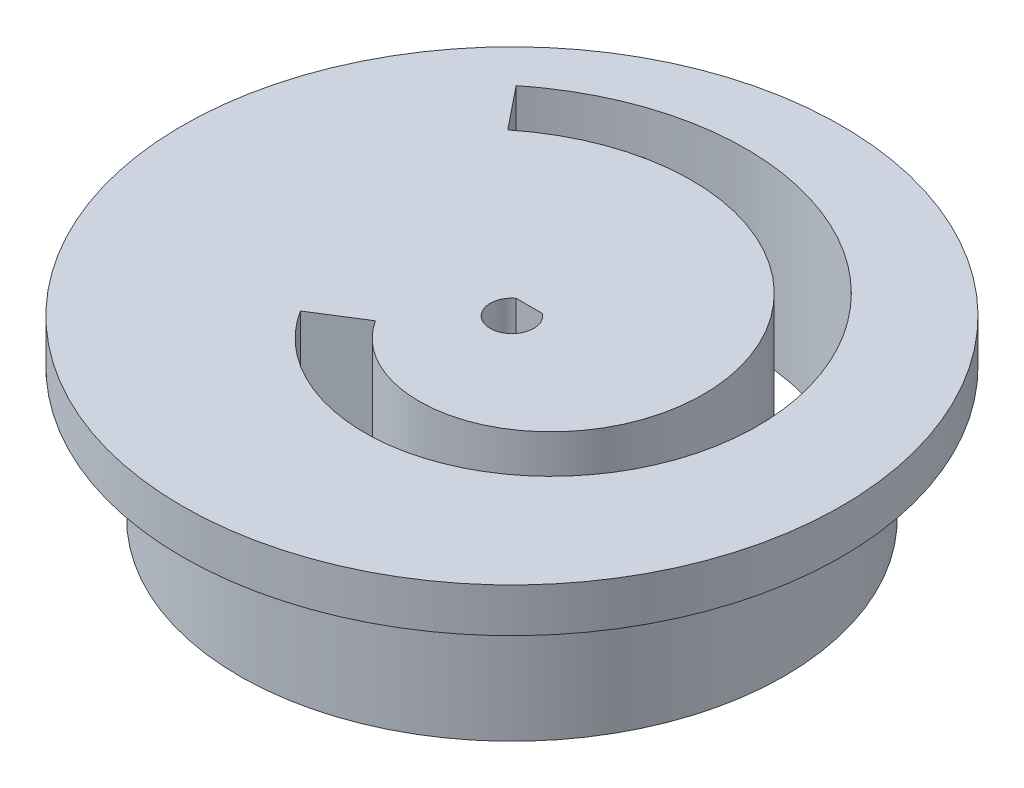
ISO-10303-21;
HEADER;
FILE_DESCRIPTION(('STEP AP214'),'2;1');
FILE_NAME('part.step','',(''),(''),'','','');
FILE_SCHEMA(('AUTOMOTIVE_DESIGN { 1 0 10303 214 1 1 1 1 }'));
ENDSEC;
DATA;
#1=APPLICATION_CONTEXT('core data for automotive mechanical design processes');
#2=APPLICATION_PROTOCOL_DEFINITION('international standard','automotive_design',2000,#1);
#3=PRODUCT_CONTEXT('',#1,'mechanical');
#4=PRODUCT('Part','Part','',(#3));
#5=PRODUCT_RELATED_PRODUCT_CATEGORY('part','',(#4));
#6=PRODUCT_DEFINITION_FORMATION('','',#4);
#7=PRODUCT_DEFINITION_CONTEXT('part definition',#1,'design');
#8=PRODUCT_DEFINITION('design','',#6,#7);
#9=PRODUCT_DEFINITION_SHAPE('','',#8);
#10=(LENGTH_UNIT() NAMED_UNIT(*) SI_UNIT(.MILLI.,.METRE.));
#11=(NAMED_UNIT(*) PLANE_ANGLE_UNIT() SI_UNIT($,.RADIAN.));
#12=(NAMED_UNIT(*) SI_UNIT($,.STERADIAN.) SOLID_ANGLE_UNIT());
#13=UNCERTAINTY_MEASURE_WITH_UNIT(LENGTH_MEASURE(1.E-05),#10,'distance_accuracy_value','');
#14=(GEOMETRIC_REPRESENTATION_CONTEXT(3) GLOBAL_UNCERTAINTY_ASSIGNED_CONTEXT((#13)) GLOBAL_UNIT_ASSIGNED_CONTEXT((#10,
#11,#12)) REPRESENTATION_CONTEXT('',''));
#15=CARTESIAN_POINT('',(0.,0.,0.));
#16=DIRECTION('',(0.,0.,1.));
#17=DIRECTION('',(1.,0.,0.));
#18=AXIS2_PLACEMENT_3D('',#15,#16,#17);
#19=CARTESIAN_POINT('',(0.,5.,0.));
#20=DIRECTION('',(0.,-1.,0.));
#21=DIRECTION('',(0.,0.,-1.));
#22=AXIS2_PLACEMENT_3D('',#19,#20,#21);
#23=CYLINDRICAL_SURFACE('',#22,37.5);
#24=CARTESIAN_POINT('',(0.,5.,0.));
#25=DIRECTION('',(0.,1.,0.));
#26=DIRECTION('',(0.,0.,1.));
#27=AXIS2_PLACEMENT_3D('',#24,#25,#26);
#28=CIRCLE('',#27,37.5);
#29=CARTESIAN_POINT('',(0.,5.,37.5));
#30=VERTEX_POINT('',#29);
#31=EDGE_CURVE('E186',#30,#30,#28,.T.);
#32=ORIENTED_EDGE('',*,*,#31,.F.);
#33=EDGE_LOOP('',(#32));
#34=FACE_BOUND('',#33,.T.);
#35=CARTESIAN_POINT('',(0.,0.,0.));
#36=DIRECTION('',(0.,1.,0.));
#37=DIRECTION('',(0.,0.,1.));
#38=AXIS2_PLACEMENT_3D('',#35,#36,#37);
#39=CIRCLE('',#38,37.5);
#40=CARTESIAN_POINT('',(0.,0.,37.5));
#41=VERTEX_POINT('',#40);
#42=EDGE_CURVE('E189',#41,#41,#39,.T.);
#43=ORIENTED_EDGE('',*,*,#42,.T.);
#44=EDGE_LOOP('',(#43));
#45=FACE_BOUND('',#44,.T.);
#46=ADVANCED_FACE('F33',(#34,#45),#23,.T.);
#47=CARTESIAN_POINT('',(0.,5.,0.));
#48=DIRECTION('',(0.,1.,0.));
#49=DIRECTION('',(0.,0.,1.));
#50=AXIS2_PLACEMENT_3D('',#47,#48,#49);
#51=PLANE('',#50);
#52=CARTESIAN_POINT('',(-12.5229604017019,5.,11.5509878834567));
#53=CARTESIAN_POINT('',(-11.6004952961157,5.,13.0163621993928));
#54=CARTESIAN_POINT('',(-10.4309767036001,5.,14.3699254940499));
#55=CARTESIAN_POINT('',(-7.6500753799408,5.,16.7161851548468));
#56=CARTESIAN_POINT('',(-6.04930775763706,5.,17.6993436339623));
#57=CARTESIAN_POINT('',(-2.52624567461753,5.,19.1649897706663));
#58=CARTESIAN_POINT('',(-0.616520535725296,5.,19.6419137684396));
#59=CARTESIAN_POINT('',(3.36164703541632,5.,19.9966669523599));
#60=CARTESIAN_POINT('',(5.41650373351934,5.,19.8729748340134));
#61=CARTESIAN_POINT('',(9.49306074908555,5.,18.9816638357261));
#62=CARTESIAN_POINT('',(11.5013996709827,5.,18.2166506958334));
#63=CARTESIAN_POINT('',(15.2816834739461,5.,16.0596794721663));
#64=CARTESIAN_POINT('',(17.0416927338188,5.,14.6741767706611));
#65=CARTESIAN_POINT('',(20.1306178558642,5.,11.3574094932143));
#66=CARTESIAN_POINT('',(21.4500847049044,5.,9.4358386409608));
#67=CARTESIAN_POINT('',(23.4919551756464,5.,5.188328830345));
#68=CARTESIAN_POINT('',(24.2082275471741,5.,2.87443265795955));
#69=CARTESIAN_POINT('',(24.9249201685777,5.,-1.966413331751));
#70=CARTESIAN_POINT('',(24.923059122942,5.,-4.4800594985828));
#71=CARTESIAN_POINT('',(24.1466443633982,5.,-9.49504246014136));
#72=CARTESIAN_POINT('',(23.3738489642896,5.,-11.9830063018267));
#73=CARTESIAN_POINT('',(21.0700954924437,5.,-16.7073582521203));
#74=CARTESIAN_POINT('',(19.544768330187,5.,-18.931495095212));
#75=CARTESIAN_POINT('',(15.8247275121424,5.,-22.8976484259414));
#76=CARTESIAN_POINT('',(13.6390101837641,5.,-24.6296223059436));
#77=CARTESIAN_POINT('',(8.75693639582438,5.,-27.4126137651256));
#78=CARTESIAN_POINT('',(6.07214004958612,5.,-28.4566862383165));
#79=CARTESIAN_POINT('',(0.409277256728125,5.,-29.7178505268334));
#80=CARTESIAN_POINT('',(-2.55569040842167,5.,-29.9317087538947));
#81=CARTESIAN_POINT('',(-8.52055394473071,5.,-29.456293242984));
#82=CARTESIAN_POINT('',(-11.506970883009,5.,-28.7677839031858));
#83=CARTESIAN_POINT('',(-17.2379411212992,5.,-26.4925211573097));
#84=CARTESIAN_POINT('',(-19.9698258260303,5.,-24.910464833472));
#85=CARTESIAN_POINT('',(-22.4458759431602,5.,-22.9242067244719));
#86=B_SPLINE_CURVE_WITH_KNOTS('',3,(#52,#53,#54,#55,#56,#57,#58,#59,#60,#61,#62,#63,#64,#65,#66,
#67,#68,#69,#70,#71,#72,#73,#74,#75,#76,#77,#78,#79,#80,#81,#82,#83,#84,#85),.UNSPECIFIED.,.F.,
.F.,(4,2,2,2,2,2,2,2,2,2,2,2,2,2,2,2,4),(0.,0.0625,0.125,0.1875,0.25,0.3125,0.375,0.4375,0.5,
0.5625,0.625,0.6875,0.75,0.8125,0.875,0.9375,1.),.UNSPECIFIED.);
#87=CARTESIAN_POINT('',(-12.5229604017019,5.,11.5509878834567));
#88=VERTEX_POINT('',#87);
#89=CARTESIAN_POINT('',(-22.4458759431602,5.,-22.9242067244719));
#90=VERTEX_POINT('',#89);
#91=EDGE_CURVE('E51',#88,#90,#86,.T.);
#92=ORIENTED_EDGE('',*,*,#91,.F.);
#93=DIRECTION('',(-0.846279182287191,0.,0.532739660272561));
#94=VECTOR('',#93,1.);
#95=CARTESIAN_POINT('',(-12.5229604017019,5.,11.5509878834567));
#96=LINE('',#95,#94);
#97=CARTESIAN_POINT('',(-7.27602947152129,5.,8.24800198976681));
#98=VERTEX_POINT('',#97);
#99=EDGE_CURVE('E295',#98,#88,#96,.T.);
#100=ORIENTED_EDGE('',*,*,#99,.F.);
#101=CARTESIAN_POINT('',(-18.5663173656599,5.,-18.0879865843475));
#102=CARTESIAN_POINT('',(-16.5740630818423,5.,-19.6861493998119));
#103=CARTESIAN_POINT('',(-14.3732618847466,5.,-20.9590867668143));
#104=CARTESIAN_POINT('',(-9.7961098196643,5.,-22.7762700957926));
#105=CARTESIAN_POINT('',(-7.40867153427233,5.,-23.3252516131446));
#106=CARTESIAN_POINT('',(-2.68238405132616,5.,-23.7019493137271));
#107=CARTESIAN_POINT('',(-0.33151274899056,5.,-23.5309346736126));
#108=CARTESIAN_POINT('',(4.11739089219686,5.,-22.5401286801503));
#109=CARTESIAN_POINT('',(6.22732020312036,5.,-21.7180051694615));
#110=CARTESIAN_POINT('',(10.0277598861644,5.,-19.5515915431096));
#111=CARTESIAN_POINT('',(11.7289844633963,5.,-18.2015502080913));
#112=CARTESIAN_POINT('',(14.5962665791881,5.,-15.144572860282));
#113=CARTESIAN_POINT('',(15.7708930715796,5.,-13.4289531028443));
#114=CARTESIAN_POINT('',(17.5275712219745,5.,-9.82649913054221));
#115=CARTESIAN_POINT('',(18.1152648217339,5.,-7.92879982989393));
#116=CARTESIAN_POINT('',(18.7004268238914,5.,-4.14914799497067));
#117=CARTESIAN_POINT('',(18.7000798314222,5.,-2.25510179651066));
#118=CARTESIAN_POINT('',(18.166772452826,5.,1.34708247030139));
#119=CARTESIAN_POINT('',(17.6323100635544,5.,3.06746971171144));
#120=CARTESIAN_POINT('',(16.1339926698692,5.,6.18427752116164));
#121=CARTESIAN_POINT('',(15.1650449028983,5.,7.59200202005319));
#122=CARTESIAN_POINT('',(12.9330090731689,5.,9.98867500810966));
#123=CARTESIAN_POINT('',(11.661654701102,5.,10.9869498688067));
#124=CARTESIAN_POINT('',(8.97616014520221,5.,12.5192513520577));
#125=CARTESIAN_POINT('',(7.55128721075826,5.,13.0597543130632));
#126=CARTESIAN_POINT('',(4.70967200455877,5.,13.6810538254985));
#127=CARTESIAN_POINT('',(3.28067084926525,5.,13.764842941522));
#128=CARTESIAN_POINT('',(0.565855338207264,5.,13.5227492063836));
#129=CARTESIAN_POINT('',(-0.732647761425421,5.,13.1960397679267));
#130=CARTESIAN_POINT('',(-3.0800342543436,5.,12.21949213305));
#131=CARTESIAN_POINT('',(-4.14087536565807,5.,11.5650064919811));
#132=CARTESIAN_POINT('',(-5.94402757615389,5.,10.0436784039367));
#133=CARTESIAN_POINT('',(-6.69667502990474,5.,9.1683306975166));
#134=CARTESIAN_POINT('',(-7.27602947152129,5.,8.24800198976681));
#135=B_SPLINE_CURVE_WITH_KNOTS('',3,(#101,#102,#103,#104,#105,#106,#107,#108,#109,#110,#111,
#112,#113,#114,#115,#116,#117,#118,#119,#120,#121,#122,#123,#124,#125,#126,#127,#128,#129,#130,
#131,#132,#133,#134),.UNSPECIFIED.,.F.,.F.,(4,2,2,2,2,2,2,2,2,2,2,2,2,2,2,2,4),(0.,0.0625,0.125,
0.1875,0.25,0.3125,0.375,0.4375,0.5,0.5625,0.625,0.6875,0.75,0.8125,0.875,0.9375,1.),.UNSPECIFIED.);
#136=CARTESIAN_POINT('',(-18.5663173656599,5.,-18.0879865843475));
#137=VERTEX_POINT('',#136);
#138=EDGE_CURVE('E105',#137,#98,#135,.T.);
#139=ORIENTED_EDGE('',*,*,#138,.F.);
#140=DIRECTION('',(0.625735254435522,0.,0.780035506471668));
#141=VECTOR('',#140,1.);
#142=CARTESIAN_POINT('',(-22.4458759431602,5.,-22.9242067244719));
#143=LINE('',#142,#141);
#144=EDGE_CURVE('E285',#90,#137,#143,.T.);
#145=ORIENTED_EDGE('',*,*,#144,.F.);
#146=EDGE_LOOP('',(#92,#100,#139,#145));
#147=FACE_BOUND('',#146,.T.);
#148=CARTESIAN_POINT('',(0.,5.,0.));
#149=DIRECTION('',(0.,-1.,0.));
#150=DIRECTION('',(0.,0.,-1.));
#151=AXIS2_PLACEMENT_3D('',#148,#149,#150);
#152=CIRCLE('',#151,2.475);
#153=CARTESIAN_POINT('',(1.49164338901763,5.,-1.975));
#154=VERTEX_POINT('',#153);
#155=CARTESIAN_POINT('',(-1.49164338901763,5.,-1.975));
#156=VERTEX_POINT('',#155);
#157=EDGE_CURVE('E223',#154,#156,#152,.T.);
#158=ORIENTED_EDGE('',*,*,#157,.T.);
#159=DIRECTION('',(1.,0.,0.));
#160=VECTOR('',#159,1.);
#161=CARTESIAN_POINT('',(1.49164338901763,5.,-1.975));
#162=LINE('',#161,#160);
#163=EDGE_CURVE('E229',#156,#154,#162,.T.);
#164=ORIENTED_EDGE('',*,*,#163,.T.);
#165=EDGE_LOOP('',(#158,#164));
#166=FACE_BOUND('',#165,.T.);
#167=ORIENTED_EDGE('',*,*,#31,.T.);
#168=EDGE_LOOP('',(#167));
#169=FACE_BOUND('',#168,.T.);
#170=ADVANCED_FACE('F161',(#147,#166,#169),#51,.T.);
#171=CARTESIAN_POINT('',(0.,0.,0.));
#172=DIRECTION('',(0.,1.,0.));
#173=DIRECTION('',(0.,0.,1.));
#174=AXIS2_PLACEMENT_3D('',#171,#172,#173);
#175=PLANE('',#174);
#176=CARTESIAN_POINT('',(0.,0.,0.));
#177=DIRECTION('',(0.,-1.,0.));
#178=DIRECTION('',(0.,0.,-1.));
#179=AXIS2_PLACEMENT_3D('',#176,#177,#178);
#180=CIRCLE('',#179,31.);
#181=CARTESIAN_POINT('',(-13.040405028587,0.,-28.1237948486758));
#182=VERTEX_POINT('',#181);
#183=CARTESIAN_POINT('',(-21.7645943525418,0.,-22.0749276934106));
#184=VERTEX_POINT('',#183);
#185=EDGE_CURVE('E43',#182,#184,#180,.T.);
#186=ORIENTED_EDGE('',*,*,#185,.F.);
#187=CARTESIAN_POINT('',(-12.5229604017019,0.,11.5509878834567));
#188=CARTESIAN_POINT('',(-11.6004952961157,0.,13.0163621993928));
#189=CARTESIAN_POINT('',(-10.4309767036001,0.,14.3699254940499));
#190=CARTESIAN_POINT('',(-7.6500753799408,0.,16.7161851548468));
#191=CARTESIAN_POINT('',(-6.04930775763706,0.,17.6993436339623));
#192=CARTESIAN_POINT('',(-2.52624567461753,0.,19.1649897706663));
#193=CARTESIAN_POINT('',(-0.616520535725296,0.,19.6419137684396));
#194=CARTESIAN_POINT('',(3.36164703541632,0.,19.9966669523599));
#195=CARTESIAN_POINT('',(5.41650373351934,0.,19.8729748340134));
#196=CARTESIAN_POINT('',(9.49306074908555,0.,18.9816638357261));
#197=CARTESIAN_POINT('',(11.5013996709827,0.,18.2166506958334));
#198=CARTESIAN_POINT('',(15.2816834739461,0.,16.0596794721663));
#199=CARTESIAN_POINT('',(17.0416927338188,0.,14.6741767706611));
#200=CARTESIAN_POINT('',(20.1306178558642,0.,11.3574094932143));
#201=CARTESIAN_POINT('',(21.4500847049044,0.,9.4358386409608));
#202=CARTESIAN_POINT('',(23.4919551756464,0.,5.188328830345));
#203=CARTESIAN_POINT('',(24.2082275471741,0.,2.87443265795955));
#204=CARTESIAN_POINT('',(24.9249201685777,0.,-1.966413331751));
#205=CARTESIAN_POINT('',(24.923059122942,0.,-4.4800594985828));
#206=CARTESIAN_POINT('',(24.1466443633982,0.,-9.49504246014136));
#207=CARTESIAN_POINT('',(23.3738489642896,0.,-11.9830063018267));
#208=CARTESIAN_POINT('',(21.0700954924437,0.,-16.7073582521203));
#209=CARTESIAN_POINT('',(19.544768330187,0.,-18.931495095212));
#210=CARTESIAN_POINT('',(15.8247275121424,0.,-22.8976484259414));
#211=CARTESIAN_POINT('',(13.6390101837641,0.,-24.6296223059436));
#212=CARTESIAN_POINT('',(8.75693639582438,0.,-27.4126137651256));
#213=CARTESIAN_POINT('',(6.07214004958612,0.,-28.4566862383165));
#214=CARTESIAN_POINT('',(0.409277256728125,0.,-29.7178505268334));
#215=CARTESIAN_POINT('',(-2.55569040842167,0.,-29.9317087538947));
#216=CARTESIAN_POINT('',(-8.52055394473071,0.,-29.456293242984));
#217=CARTESIAN_POINT('',(-11.506970883009,0.,-28.7677839031858));
#218=CARTESIAN_POINT('',(-17.2379411212992,0.,-26.4925211573097));
#219=CARTESIAN_POINT('',(-19.9698258260303,0.,-24.910464833472));
#220=CARTESIAN_POINT('',(-22.4458759431602,0.,-22.9242067244719));
#221=B_SPLINE_CURVE_WITH_KNOTS('',3,(#187,#188,#189,#190,#191,#192,#193,#194,#195,#196,#197,
#198,#199,#200,#201,#202,#203,#204,#205,#206,#207,#208,#209,#210,#211,#212,#213,#214,#215,#216,
#217,#218,#219,#220),.UNSPECIFIED.,.F.,.F.,(4,2,2,2,2,2,2,2,2,2,2,2,2,2,2,2,4),(0.,0.0625,0.125,
0.1875,0.25,0.3125,0.375,0.4375,0.5,0.5625,0.625,0.6875,0.75,0.8125,0.875,0.9375,1.),.UNSPECIFIED.);
#222=CARTESIAN_POINT('',(-22.4458759431602,0.,-22.9242067244719));
#223=VERTEX_POINT('',#222);
#224=EDGE_CURVE('E209',#182,#223,#221,.T.);
#225=ORIENTED_EDGE('',*,*,#224,.T.);
#226=DIRECTION('',(0.625735254435522,0.,0.780035506471668));
#227=VECTOR('',#226,1.);
#228=CARTESIAN_POINT('',(-2.46810713388234,0.,1.97988634181499));
#229=LINE('',#228,#227);
#230=EDGE_CURVE('E210',#223,#184,#229,.T.);
#231=ORIENTED_EDGE('',*,*,#230,.T.);
#232=EDGE_LOOP('',(#186,#225,#231));
#233=FACE_BOUND('',#232,.T.);
#234=ORIENTED_EDGE('',*,*,#42,.F.);
#235=EDGE_LOOP('',(#234));
#236=FACE_BOUND('',#235,.T.);
#237=ADVANCED_FACE('F169',(#233,#236),#175,.F.);
#238=CARTESIAN_POINT('',(0.,-15.,0.));
#239=DIRECTION('',(0.,1.,0.));
#240=DIRECTION('',(0.,0.,1.));
#241=AXIS2_PLACEMENT_3D('',#238,#239,#240);
#242=CYLINDRICAL_SURFACE('',#241,31.);
#243=CARTESIAN_POINT('',(0.,-15.,0.));
#244=DIRECTION('',(0.,-1.,0.));
#245=DIRECTION('',(0.,0.,-1.));
#246=AXIS2_PLACEMENT_3D('',#243,#244,#245);
#247=CIRCLE('',#246,31.);
#248=CARTESIAN_POINT('',(-13.039924450477,-15.,-28.1240176544793));
#249=VERTEX_POINT('',#248);
#250=CARTESIAN_POINT('',(-21.7645943525418,-15.,-22.0749276934106));
#251=VERTEX_POINT('',#250);
#252=EDGE_CURVE('E190',#249,#251,#247,.T.);
#253=ORIENTED_EDGE('',*,*,#252,.F.);
#254=DIRECTION('',(0.,1.,0.));
#255=VECTOR('',#254,1.);
#256=CARTESIAN_POINT('',(-13.040405028587,-15.,-28.1237948486758));
#257=LINE('',#256,#255);
#258=EDGE_CURVE('E206',#249,#182,#257,.T.);
#259=ORIENTED_EDGE('',*,*,#258,.T.);
#260=ORIENTED_EDGE('',*,*,#185,.T.);
#261=DIRECTION('',(0.,1.,0.));
#262=VECTOR('',#261,1.);
#263=CARTESIAN_POINT('',(-21.7645943525418,-15.,-22.0749276934106));
#264=LINE('',#263,#262);
#265=EDGE_CURVE('E205',#184,#251,#264,.F.);
#266=ORIENTED_EDGE('',*,*,#265,.T.);
#267=EDGE_LOOP('',(#253,#259,#260,#266));
#268=FACE_BOUND('',#267,.T.);
#269=ADVANCED_FACE('F145',(#268),#242,.T.);
#270=CARTESIAN_POINT('',(0.,-15.,0.));
#271=DIRECTION('',(0.,-1.,0.));
#272=DIRECTION('',(0.,0.,-1.));
#273=AXIS2_PLACEMENT_3D('',#270,#271,#272);
#274=PLANE('',#273);
#275=CARTESIAN_POINT('',(-13.0399068274558,-15.,-28.123966523314));
#276=CARTESIAN_POINT('',(-10.5868733404784,-15.,-28.9692314536273));
#277=CARTESIAN_POINT('',(-8.06107184558715,-15.,-29.4929151900895));
#278=CARTESIAN_POINT('',(-2.55569040842167,-15.,-29.9317087538947));
#279=CARTESIAN_POINT('',(0.409277256728125,-15.,-29.7178505268334));
#280=CARTESIAN_POINT('',(6.07214004958612,-15.,-28.4566862383165));
#281=CARTESIAN_POINT('',(8.75693639582438,-15.,-27.4126137651256));
#282=CARTESIAN_POINT('',(13.6390101837641,-15.,-24.6296223059436));
#283=CARTESIAN_POINT('',(15.8247275121424,-15.,-22.8976484259414));
#284=CARTESIAN_POINT('',(19.544768330187,-15.,-18.931495095212));
#285=CARTESIAN_POINT('',(21.0700954924437,-15.,-16.7073582521203));
#286=CARTESIAN_POINT('',(23.3738489642896,-15.,-11.9830063018267));
#287=CARTESIAN_POINT('',(24.1466443633982,-15.,-9.49504246014136));
#288=CARTESIAN_POINT('',(24.923059122942,-15.,-4.4800594985828));
#289=CARTESIAN_POINT('',(24.9249201685777,-15.,-1.966413331751));
#290=CARTESIAN_POINT('',(24.2082275471741,-15.,2.87443265795955));
#291=CARTESIAN_POINT('',(23.4919551756464,-15.,5.188328830345));
#292=CARTESIAN_POINT('',(21.4500847049044,-15.,9.4358386409608));
#293=CARTESIAN_POINT('',(20.1306178558642,-15.,11.3574094932143));
#294=CARTESIAN_POINT('',(17.0416927338188,-15.,14.6741767706611));
#295=CARTESIAN_POINT('',(15.2816834739461,-15.,16.0596794721663));
#296=CARTESIAN_POINT('',(11.5013996709827,-15.,18.2166506958334));
#297=CARTESIAN_POINT('',(9.49306074908555,-15.,18.9816638357261));
#298=CARTESIAN_POINT('',(5.41650373351934,-15.,19.8729748340134));
#299=CARTESIAN_POINT('',(3.36164703541632,-15.,19.9966669523599));
#300=CARTESIAN_POINT('',(-0.616520535725296,-15.,19.6419137684396));
#301=CARTESIAN_POINT('',(-2.52624567461753,-15.,19.1649897706663));
#302=CARTESIAN_POINT('',(-6.04930775763706,-15.,17.6993436339623));
#303=CARTESIAN_POINT('',(-7.6500753799408,-15.,16.7161851548468));
#304=CARTESIAN_POINT('',(-10.4309767036001,-15.,14.3699254940499));
#305=CARTESIAN_POINT('',(-11.6004952961157,-15.,13.0163621993928));
#306=CARTESIAN_POINT('',(-12.5229604017019,-15.,11.5509878834567));
#307=B_SPLINE_CURVE_WITH_KNOTS('',3,(#275,#276,#277,#278,#279,#280,#281,#282,#283,#284,#285,
#286,#287,#288,#289,#290,#291,#292,#293,#294,#295,#296,#297,#298,#299,#300,#301,#302,#303,#304,
#305,#306),.UNSPECIFIED.,.F.,.F.,(4,2,2,2,2,2,2,2,2,2,2,2,2,2,2,4),(0.,0.0528710685008421,
0.115371068500842,0.177871068500842,0.240371068500842,0.302871068500842,0.365371068500842,
0.427871068500842,0.490371068500842,0.552871068500842,0.615371068500842,0.677871068500842,
0.740371068500842,0.802871068500842,0.865371068500842,0.927871068500842),.UNSPECIFIED.);
#308=CARTESIAN_POINT('',(-12.5229604017019,-15.,11.5509878834567));
#309=VERTEX_POINT('',#308);
#310=EDGE_CURVE('E126',#309,#249,#307,.F.);
#311=ORIENTED_EDGE('',*,*,#310,.T.);
#312=ORIENTED_EDGE('',*,*,#252,.T.);
#313=DIRECTION('',(-0.625735254435522,0.,-0.780035506471668));
#314=VECTOR('',#313,1.);
#315=CARTESIAN_POINT('',(-2.46810713388234,-15.,1.97988634181499));
#316=LINE('',#315,#314);
#317=CARTESIAN_POINT('',(-18.5663173656599,-15.,-18.0879865843475));
#318=VERTEX_POINT('',#317);
#319=EDGE_CURVE('E11',#318,#251,#316,.T.);
#320=ORIENTED_EDGE('',*,*,#319,.F.);
#321=CARTESIAN_POINT('',(-7.27602947152129,-15.,8.24800198976681));
#322=CARTESIAN_POINT('',(-6.69667502990474,-15.,9.1683306975166));
#323=CARTESIAN_POINT('',(-5.94402757615389,-15.,10.0436784039367));
#324=CARTESIAN_POINT('',(-4.14087536565807,-15.,11.5650064919811));
#325=CARTESIAN_POINT('',(-3.0800342543436,-15.,12.21949213305));
#326=CARTESIAN_POINT('',(-0.732647761425421,-15.,13.1960397679267));
#327=CARTESIAN_POINT('',(0.565855338207264,-15.,13.5227492063836));
#328=CARTESIAN_POINT('',(3.28067084926525,-15.,13.764842941522));
#329=CARTESIAN_POINT('',(4.70967200455877,-15.,13.6810538254985));
#330=CARTESIAN_POINT('',(7.55128721075826,-15.,13.0597543130632));
#331=CARTESIAN_POINT('',(8.97616014520221,-15.,12.5192513520577));
#332=CARTESIAN_POINT('',(11.661654701102,-15.,10.9869498688067));
#333=CARTESIAN_POINT('',(12.9330090731689,-15.,9.98867500810966));
#334=CARTESIAN_POINT('',(15.1650449028983,-15.,7.59200202005319));
#335=CARTESIAN_POINT('',(16.1339926698692,-15.,6.18427752116164));
#336=CARTESIAN_POINT('',(17.6323100635544,-15.,3.06746971171144));
#337=CARTESIAN_POINT('',(18.166772452826,-15.,1.34708247030139));
#338=CARTESIAN_POINT('',(18.7000798314222,-15.,-2.25510179651066));
#339=CARTESIAN_POINT('',(18.7004268238914,-15.,-4.14914799497067));
#340=CARTESIAN_POINT('',(18.1152648217339,-15.,-7.92879982989393));
#341=CARTESIAN_POINT('',(17.5275712219745,-15.,-9.82649913054221));
#342=CARTESIAN_POINT('',(15.7708930715796,-15.,-13.4289531028443));
#343=CARTESIAN_POINT('',(14.5962665791881,-15.,-15.144572860282));
#344=CARTESIAN_POINT('',(11.7289844633963,-15.,-18.2015502080913));
#345=CARTESIAN_POINT('',(10.0277598861644,-15.,-19.5515915431096));
#346=CARTESIAN_POINT('',(6.22732020312036,-15.,-21.7180051694615));
#347=CARTESIAN_POINT('',(4.11739089219686,-15.,-22.5401286801503));
#348=CARTESIAN_POINT('',(-0.33151274899056,-15.,-23.5309346736126));
#349=CARTESIAN_POINT('',(-2.68238405132616,-15.,-23.7019493137271));
#350=CARTESIAN_POINT('',(-7.40867153427233,-15.,-23.3252516131446));
#351=CARTESIAN_POINT('',(-9.7961098196643,-15.,-22.7762700957926));
#352=CARTESIAN_POINT('',(-14.3732618847466,-15.,-20.9590867668143));
#353=CARTESIAN_POINT('',(-16.5740630818423,-15.,-19.6861493998119));
#354=CARTESIAN_POINT('',(-18.5663173656599,-15.,-18.0879865843475));
#355=B_SPLINE_CURVE_WITH_KNOTS('',3,(#321,#322,#323,#324,#325,#326,#327,#328,#329,#330,#331,
#332,#333,#334,#335,#336,#337,#338,#339,#340,#341,#342,#343,#344,#345,#346,#347,#348,#349,#350,
#351,#352,#353,#354),.UNSPECIFIED.,.F.,.F.,(4,2,2,2,2,2,2,2,2,2,2,2,2,2,2,2,4),(0.,0.0625,0.125,
0.1875,0.25,0.3125,0.375,0.4375,0.5,0.5625,0.625,0.6875,0.75,0.8125,0.875,0.9375,1.),.UNSPECIFIED.);
#356=CARTESIAN_POINT('',(-7.27602947152129,-15.,8.24800198976681));
#357=VERTEX_POINT('',#356);
#358=EDGE_CURVE('E60',#318,#357,#355,.F.);
#359=ORIENTED_EDGE('',*,*,#358,.T.);
#360=DIRECTION('',(-0.846279182287191,0.,0.532739660272561));
#361=VECTOR('',#360,1.);
#362=CARTESIAN_POINT('',(-12.5229604017019,-15.,11.5509878834567));
#363=LINE('',#362,#361);
#364=EDGE_CURVE('E114',#357,#309,#363,.T.);
#365=ORIENTED_EDGE('',*,*,#364,.T.);
#366=EDGE_LOOP('',(#311,#312,#320,#359,#365));
#367=FACE_BOUND('',#366,.T.);
#368=CARTESIAN_POINT('',(0.,-15.,0.));
#369=DIRECTION('',(0.,-1.,0.));
#370=DIRECTION('',(0.,0.,-1.));
#371=AXIS2_PLACEMENT_3D('',#368,#369,#370);
#372=CIRCLE('',#371,2.475);
#373=CARTESIAN_POINT('',(1.49164338901763,-15.,-1.975));
#374=VERTEX_POINT('',#373);
#375=CARTESIAN_POINT('',(-1.49164338901763,-15.,-1.975));
#376=VERTEX_POINT('',#375);
#377=EDGE_CURVE('E222',#374,#376,#372,.T.);
#378=ORIENTED_EDGE('',*,*,#377,.F.);
#379=DIRECTION('',(1.,0.,0.));
#380=VECTOR('',#379,1.);
#381=CARTESIAN_POINT('',(1.49164338901763,-15.,-1.975));
#382=LINE('',#381,#380);
#383=EDGE_CURVE('E230',#376,#374,#382,.T.);
#384=ORIENTED_EDGE('',*,*,#383,.F.);
#385=EDGE_LOOP('',(#378,#384));
#386=FACE_BOUND('',#385,.T.);
#387=ADVANCED_FACE('F123',(#367,#386),#274,.T.);
#388=CARTESIAN_POINT('',(0.,5.,0.));
#389=DIRECTION('',(0.,-1.,0.));
#390=DIRECTION('',(0.,0.,-1.));
#391=AXIS2_PLACEMENT_3D('',#388,#389,#390);
#392=CYLINDRICAL_SURFACE('',#391,2.475);
#393=ORIENTED_EDGE('',*,*,#377,.T.);
#394=DIRECTION('',(0.,-1.,0.));
#395=VECTOR('',#394,1.);
#396=CARTESIAN_POINT('',(-1.49164338901763,5.,-1.975));
#397=LINE('',#396,#395);
#398=EDGE_CURVE('E199',#156,#376,#397,.T.);
#399=ORIENTED_EDGE('',*,*,#398,.F.);
#400=ORIENTED_EDGE('',*,*,#157,.F.);
#401=DIRECTION('',(0.,-1.,0.));
#402=VECTOR('',#401,1.);
#403=CARTESIAN_POINT('',(1.49164338901763,5.,-1.975));
#404=LINE('',#403,#402);
#405=EDGE_CURVE('E193',#154,#374,#404,.T.);
#406=ORIENTED_EDGE('',*,*,#405,.T.);
#407=EDGE_LOOP('',(#393,#399,#400,#406));
#408=FACE_BOUND('',#407,.T.);
#409=ADVANCED_FACE('F144',(#408),#392,.F.);
#410=CARTESIAN_POINT('',(1.49164338901763,5.,-1.975));
#411=DIRECTION('',(0.,0.,-1.));
#412=DIRECTION('',(-1.,0.,0.));
#413=AXIS2_PLACEMENT_3D('',#410,#411,#412);
#414=PLANE('',#413);
#415=ORIENTED_EDGE('',*,*,#383,.T.);
#416=ORIENTED_EDGE('',*,*,#405,.F.);
#417=ORIENTED_EDGE('',*,*,#163,.F.);
#418=ORIENTED_EDGE('',*,*,#398,.T.);
#419=EDGE_LOOP('',(#415,#416,#417,#418));
#420=FACE_BOUND('',#419,.T.);
#421=ADVANCED_FACE('F241',(#420),#414,.F.);
#422=CARTESIAN_POINT('',(-12.5229604017019,-15.,11.5509878834567));
#423=CARTESIAN_POINT('',(-11.6004952961157,-15.,13.0163621993928));
#424=CARTESIAN_POINT('',(-10.4309767036001,-15.,14.3699254940499));
#425=CARTESIAN_POINT('',(-7.6500753799408,-15.,16.7161851548468));
#426=CARTESIAN_POINT('',(-6.04930775763706,-15.,17.6993436339623));
#427=CARTESIAN_POINT('',(-2.52624567461753,-15.,19.1649897706663));
#428=CARTESIAN_POINT('',(-0.616520535725296,-15.,19.6419137684396));
#429=CARTESIAN_POINT('',(3.36164703541632,-15.,19.9966669523599));
#430=CARTESIAN_POINT('',(5.41650373351934,-15.,19.8729748340134));
#431=CARTESIAN_POINT('',(9.49306074908555,-15.,18.9816638357261));
#432=CARTESIAN_POINT('',(11.5013996709827,-15.,18.2166506958334));
#433=CARTESIAN_POINT('',(15.2816834739461,-15.,16.0596794721663));
#434=CARTESIAN_POINT('',(17.0416927338188,-15.,14.6741767706611));
#435=CARTESIAN_POINT('',(20.1306178558642,-15.,11.3574094932143));
#436=CARTESIAN_POINT('',(21.4500847049044,-15.,9.4358386409608));
#437=CARTESIAN_POINT('',(23.4919551756464,-15.,5.188328830345));
#438=CARTESIAN_POINT('',(24.2082275471741,-15.,2.87443265795955));
#439=CARTESIAN_POINT('',(24.9249201685777,-15.,-1.966413331751));
#440=CARTESIAN_POINT('',(24.923059122942,-15.,-4.4800594985828));
#441=CARTESIAN_POINT('',(24.1466443633982,-15.,-9.49504246014136));
#442=CARTESIAN_POINT('',(23.3738489642896,-15.,-11.9830063018267));
#443=CARTESIAN_POINT('',(21.0700954924437,-15.,-16.7073582521203));
#444=CARTESIAN_POINT('',(19.544768330187,-15.,-18.931495095212));
#445=CARTESIAN_POINT('',(15.8247275121424,-15.,-22.8976484259414));
#446=CARTESIAN_POINT('',(13.6390101837641,-15.,-24.6296223059436));
#447=CARTESIAN_POINT('',(8.75693639582438,-15.,-27.4126137651256));
#448=CARTESIAN_POINT('',(6.07214004958612,-15.,-28.4566862383165));
#449=CARTESIAN_POINT('',(0.409277256728125,-15.,-29.7178505268334));
#450=CARTESIAN_POINT('',(-2.55569040842167,-15.,-29.9317087538947));
#451=CARTESIAN_POINT('',(-8.52055394473071,-15.,-29.456293242984));
#452=CARTESIAN_POINT('',(-11.506970883009,-15.,-28.7677839031858));
#453=CARTESIAN_POINT('',(-17.2379411212992,-15.,-26.4925211573097));
#454=CARTESIAN_POINT('',(-19.9698258260303,-15.,-24.910464833472));
#455=CARTESIAN_POINT('',(-22.4458759431602,-15.,-22.9242067244719));
#456=B_SPLINE_CURVE_WITH_KNOTS('',3,(#422,#423,#424,#425,#426,#427,#428,#429,#430,#431,#432,
#433,#434,#435,#436,#437,#438,#439,#440,#441,#442,#443,#444,#445,#446,#447,#448,#449,#450,#451,
#452,#453,#454,#455),.UNSPECIFIED.,.F.,.F.,(4,2,2,2,2,2,2,2,2,2,2,2,2,2,2,2,4),(0.,0.0625,0.125,
0.1875,0.25,0.3125,0.375,0.4375,0.5,0.5625,0.625,0.6875,0.75,0.8125,0.875,0.9375,1.),.UNSPECIFIED.);
#457=DIRECTION('',(0.,1.,0.));
#458=VECTOR('',#457,1.);
#459=SURFACE_OF_LINEAR_EXTRUSION('',#456,#458);
#460=ORIENTED_EDGE('',*,*,#258,.F.);
#461=ORIENTED_EDGE('',*,*,#310,.F.);
#462=DIRECTION('',(0.,1.,0.));
#463=VECTOR('',#462,1.);
#464=CARTESIAN_POINT('',(-12.5229604017019,-15.,11.5509878834567));
#465=LINE('',#464,#463);
#466=EDGE_CURVE('E110',#309,#88,#465,.T.);
#467=ORIENTED_EDGE('',*,*,#466,.T.);
#468=ORIENTED_EDGE('',*,*,#91,.T.);
#469=DIRECTION('',(0.,1.,0.));
#470=VECTOR('',#469,1.);
#471=CARTESIAN_POINT('',(-22.4458759431602,-15.,-22.9242067244719));
#472=LINE('',#471,#470);
#473=EDGE_CURVE('E119',#223,#90,#472,.T.);
#474=ORIENTED_EDGE('',*,*,#473,.F.);
#475=ORIENTED_EDGE('',*,*,#224,.F.);
#476=EDGE_LOOP('',(#460,#461,#467,#468,#474,#475));
#477=FACE_BOUND('',#476,.T.);
#478=ADVANCED_FACE('F247',(#477),#459,.F.);
#479=CARTESIAN_POINT('',(-22.4458759431602,-15.,-22.9242067244719));
#480=DIRECTION('',(-0.780035506471668,0.,0.625735254435522));
#481=DIRECTION('',(0.625735254435522,0.,0.780035506471668));
#482=AXIS2_PLACEMENT_3D('',#479,#480,#481);
#483=PLANE('',#482);
#484=ORIENTED_EDGE('',*,*,#473,.T.);
#485=ORIENTED_EDGE('',*,*,#144,.T.);
#486=DIRECTION('',(0.,1.,0.));
#487=VECTOR('',#486,1.);
#488=CARTESIAN_POINT('',(-18.5663173656599,-15.,-18.0879865843475));
#489=LINE('',#488,#487);
#490=EDGE_CURVE('E111',#318,#137,#489,.T.);
#491=ORIENTED_EDGE('',*,*,#490,.F.);
#492=ORIENTED_EDGE('',*,*,#319,.T.);
#493=ORIENTED_EDGE('',*,*,#265,.F.);
#494=ORIENTED_EDGE('',*,*,#230,.F.);
#495=EDGE_LOOP('',(#484,#485,#491,#492,#493,#494));
#496=FACE_BOUND('',#495,.T.);
#497=ADVANCED_FACE('F251',(#496),#483,.F.);
#498=CARTESIAN_POINT('',(-12.5229604017019,-15.,11.5509878834567));
#499=DIRECTION('',(-0.532739660272561,0.,-0.84627918228719));
#500=DIRECTION('',(-0.84627918228719,0.,0.532739660272561));
#501=AXIS2_PLACEMENT_3D('',#498,#499,#500);
#502=PLANE('',#501);
#503=ORIENTED_EDGE('',*,*,#99,.T.);
#504=ORIENTED_EDGE('',*,*,#466,.F.);
#505=ORIENTED_EDGE('',*,*,#364,.F.);
#506=DIRECTION('',(0.,1.,0.));
#507=VECTOR('',#506,1.);
#508=CARTESIAN_POINT('',(-7.27602947152129,-15.,8.24800198976681));
#509=LINE('',#508,#507);
#510=EDGE_CURVE('E101',#357,#98,#509,.T.);
#511=ORIENTED_EDGE('',*,*,#510,.T.);
#512=EDGE_LOOP('',(#503,#504,#505,#511));
#513=FACE_BOUND('',#512,.T.);
#514=ADVANCED_FACE('F115',(#513),#502,.F.);
#515=CARTESIAN_POINT('',(-18.5663173656599,-15.,-18.0879865843475));
#516=CARTESIAN_POINT('',(-16.5740630818423,-15.,-19.6861493998119));
#517=CARTESIAN_POINT('',(-14.3732618847466,-15.,-20.9590867668143));
#518=CARTESIAN_POINT('',(-9.7961098196643,-15.,-22.7762700957926));
#519=CARTESIAN_POINT('',(-7.40867153427233,-15.,-23.3252516131446));
#520=CARTESIAN_POINT('',(-2.68238405132616,-15.,-23.7019493137271));
#521=CARTESIAN_POINT('',(-0.33151274899056,-15.,-23.5309346736126));
#522=CARTESIAN_POINT('',(4.11739089219686,-15.,-22.5401286801503));
#523=CARTESIAN_POINT('',(6.22732020312036,-15.,-21.7180051694615));
#524=CARTESIAN_POINT('',(10.0277598861644,-15.,-19.5515915431096));
#525=CARTESIAN_POINT('',(11.7289844633963,-15.,-18.2015502080913));
#526=CARTESIAN_POINT('',(14.5962665791881,-15.,-15.144572860282));
#527=CARTESIAN_POINT('',(15.7708930715796,-15.,-13.4289531028443));
#528=CARTESIAN_POINT('',(17.5275712219745,-15.,-9.82649913054221));
#529=CARTESIAN_POINT('',(18.1152648217339,-15.,-7.92879982989393));
#530=CARTESIAN_POINT('',(18.7004268238914,-15.,-4.14914799497067));
#531=CARTESIAN_POINT('',(18.7000798314222,-15.,-2.25510179651066));
#532=CARTESIAN_POINT('',(18.166772452826,-15.,1.34708247030139));
#533=CARTESIAN_POINT('',(17.6323100635544,-15.,3.06746971171144));
#534=CARTESIAN_POINT('',(16.1339926698692,-15.,6.18427752116164));
#535=CARTESIAN_POINT('',(15.1650449028983,-15.,7.59200202005319));
#536=CARTESIAN_POINT('',(12.9330090731689,-15.,9.98867500810966));
#537=CARTESIAN_POINT('',(11.661654701102,-15.,10.9869498688067));
#538=CARTESIAN_POINT('',(8.97616014520221,-15.,12.5192513520577));
#539=CARTESIAN_POINT('',(7.55128721075826,-15.,13.0597543130632));
#540=CARTESIAN_POINT('',(4.70967200455877,-15.,13.6810538254985));
#541=CARTESIAN_POINT('',(3.28067084926525,-15.,13.764842941522));
#542=CARTESIAN_POINT('',(0.565855338207264,-15.,13.5227492063836));
#543=CARTESIAN_POINT('',(-0.732647761425421,-15.,13.1960397679267));
#544=CARTESIAN_POINT('',(-3.0800342543436,-15.,12.21949213305));
#545=CARTESIAN_POINT('',(-4.14087536565807,-15.,11.5650064919811));
#546=CARTESIAN_POINT('',(-5.94402757615389,-15.,10.0436784039367));
#547=CARTESIAN_POINT('',(-6.69667502990474,-15.,9.1683306975166));
#548=CARTESIAN_POINT('',(-7.27602947152129,-15.,8.24800198976681));
#549=B_SPLINE_CURVE_WITH_KNOTS('',3,(#515,#516,#517,#518,#519,#520,#521,#522,#523,#524,#525,
#526,#527,#528,#529,#530,#531,#532,#533,#534,#535,#536,#537,#538,#539,#540,#541,#542,#543,#544,
#545,#546,#547,#548),.UNSPECIFIED.,.F.,.F.,(4,2,2,2,2,2,2,2,2,2,2,2,2,2,2,2,4),(0.,0.0625,0.125,
0.1875,0.25,0.3125,0.375,0.4375,0.5,0.5625,0.625,0.6875,0.75,0.8125,0.875,0.9375,1.),.UNSPECIFIED.);
#550=DIRECTION('',(0.,1.,0.));
#551=VECTOR('',#550,1.);
#552=SURFACE_OF_LINEAR_EXTRUSION('',#549,#551);
#553=ORIENTED_EDGE('',*,*,#138,.T.);
#554=ORIENTED_EDGE('',*,*,#510,.F.);
#555=ORIENTED_EDGE('',*,*,#358,.F.);
#556=ORIENTED_EDGE('',*,*,#490,.T.);
#557=EDGE_LOOP('',(#553,#554,#555,#556));
#558=FACE_BOUND('',#557,.T.);
#559=ADVANCED_FACE('F103',(#558),#552,.F.);
#560=CLOSED_SHELL('',(#46,#170,#237,#269,#387,#409,#421,#478,#497,#514,#559));
#561=MANIFOLD_SOLID_BREP('B2',#560);
#562=ADVANCED_BREP_SHAPE_REPRESENTATION('',(#18,#561),#14);
#563=SHAPE_DEFINITION_REPRESENTATION(#9,#562);
ENDSEC;
END-ISO-10303-21;
